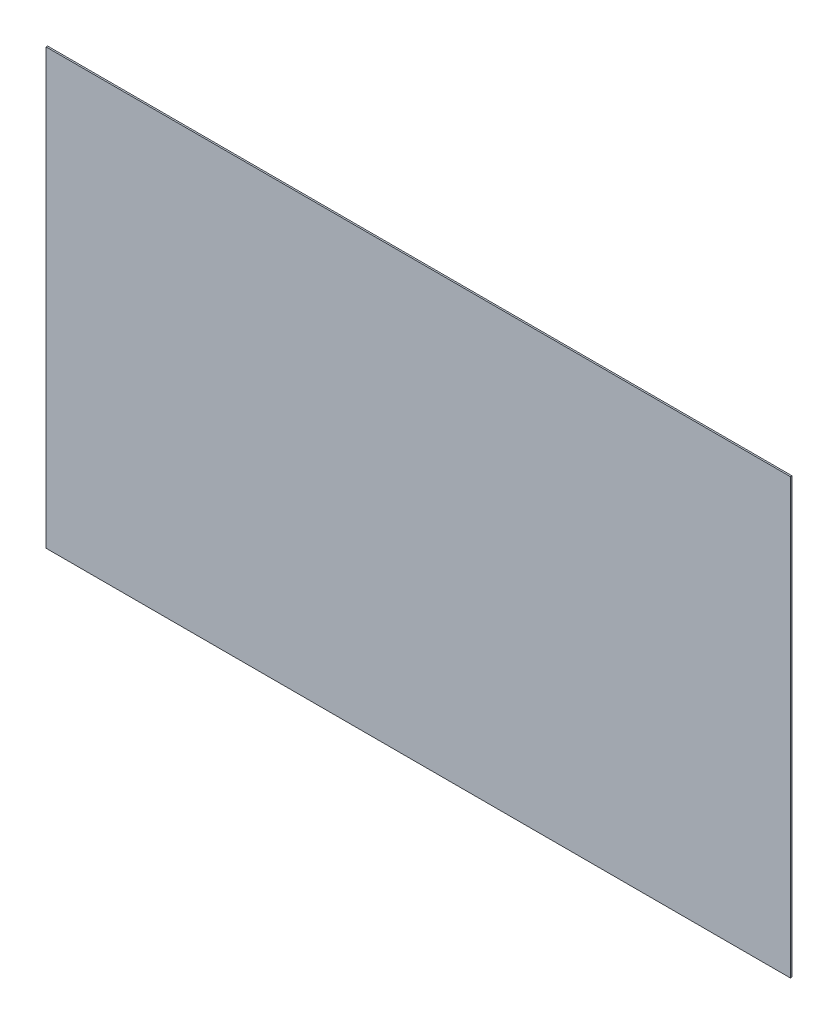
ISO-10303-21;
HEADER;
FILE_DESCRIPTION(('STEP AP214'),'2;1');
FILE_NAME('part.step','',(''),(''),'','','');
FILE_SCHEMA(('AUTOMOTIVE_DESIGN { 1 0 10303 214 1 1 1 1 }'));
ENDSEC;
DATA;
#1=APPLICATION_CONTEXT('core data for automotive mechanical design processes');
#2=APPLICATION_PROTOCOL_DEFINITION('international standard','automotive_design',2000,#1);
#3=PRODUCT_CONTEXT('',#1,'mechanical');
#4=PRODUCT('Part','Part','',(#3));
#5=PRODUCT_RELATED_PRODUCT_CATEGORY('part','',(#4));
#6=PRODUCT_DEFINITION_FORMATION('','',#4);
#7=PRODUCT_DEFINITION_CONTEXT('part definition',#1,'design');
#8=PRODUCT_DEFINITION('design','',#6,#7);
#9=PRODUCT_DEFINITION_SHAPE('','',#8);
#10=(LENGTH_UNIT() NAMED_UNIT(*) SI_UNIT(.MILLI.,.METRE.));
#11=(NAMED_UNIT(*) PLANE_ANGLE_UNIT() SI_UNIT($,.RADIAN.));
#12=(NAMED_UNIT(*) SI_UNIT($,.STERADIAN.) SOLID_ANGLE_UNIT());
#13=UNCERTAINTY_MEASURE_WITH_UNIT(LENGTH_MEASURE(1.E-05),#10,'distance_accuracy_value','');
#14=(GEOMETRIC_REPRESENTATION_CONTEXT(3) GLOBAL_UNCERTAINTY_ASSIGNED_CONTEXT((#13)) GLOBAL_UNIT_ASSIGNED_CONTEXT((#10,
#11,#12)) REPRESENTATION_CONTEXT('',''));
#15=CARTESIAN_POINT('',(0.,0.,0.));
#16=DIRECTION('',(0.,0.,1.));
#17=DIRECTION('',(1.,0.,0.));
#18=AXIS2_PLACEMENT_3D('',#15,#16,#17);
#19=CARTESIAN_POINT('',(-720.,1070.,-490.999999999995));
#20=DIRECTION('',(1.,0.,0.));
#21=DIRECTION('',(0.,1.,0.));
#22=AXIS2_PLACEMENT_3D('',#19,#20,#21);
#23=PLANE('',#22);
#24=DIRECTION('',(0.,-1.,0.));
#25=VECTOR('',#24,1.);
#26=CARTESIAN_POINT('',(-720.,1070.,-493.999999999995));
#27=LINE('',#26,#25);
#28=CARTESIAN_POINT('',(-720.,1070.,-493.999999999995));
#29=VERTEX_POINT('',#28);
#30=CARTESIAN_POINT('',(-720.,230.,-493.999999999995));
#31=VERTEX_POINT('',#30);
#32=EDGE_CURVE('E99',#29,#31,#27,.T.);
#33=ORIENTED_EDGE('',*,*,#32,.T.);
#34=DIRECTION('',(0.,0.,-1.));
#35=VECTOR('',#34,1.);
#36=CARTESIAN_POINT('',(-720.,230.,-490.999999999995));
#37=LINE('',#36,#35);
#38=CARTESIAN_POINT('',(-720.,230.,-490.999999999995));
#39=VERTEX_POINT('',#38);
#40=EDGE_CURVE('E11',#39,#31,#37,.T.);
#41=ORIENTED_EDGE('',*,*,#40,.F.);
#42=DIRECTION('',(0.,-1.,0.));
#43=VECTOR('',#42,1.);
#44=CARTESIAN_POINT('',(-720.,1070.,-490.999999999995));
#45=LINE('',#44,#43);
#46=CARTESIAN_POINT('',(-720.,1070.,-490.999999999995));
#47=VERTEX_POINT('',#46);
#48=EDGE_CURVE('E87',#47,#39,#45,.T.);
#49=ORIENTED_EDGE('',*,*,#48,.F.);
#50=DIRECTION('',(0.,0.,-1.));
#51=VECTOR('',#50,1.);
#52=CARTESIAN_POINT('',(-720.,1070.,-490.999999999995));
#53=LINE('',#52,#51);
#54=EDGE_CURVE('E95',#47,#29,#53,.T.);
#55=ORIENTED_EDGE('',*,*,#54,.T.);
#56=EDGE_LOOP('',(#33,#41,#49,#55));
#57=FACE_BOUND('',#56,.T.);
#58=ADVANCED_FACE('F36',(#57),#23,.F.);
#59=CARTESIAN_POINT('',(-720.,230.,-490.999999999995));
#60=DIRECTION('',(0.,1.,0.));
#61=DIRECTION('',(0.,0.,1.));
#62=AXIS2_PLACEMENT_3D('',#59,#60,#61);
#63=PLANE('',#62);
#64=DIRECTION('',(1.,0.,0.));
#65=VECTOR('',#64,1.);
#66=CARTESIAN_POINT('',(-720.,230.,-493.999999999995));
#67=LINE('',#66,#65);
#68=CARTESIAN_POINT('',(720.,230.,-493.999999999995));
#69=VERTEX_POINT('',#68);
#70=EDGE_CURVE('E91',#31,#69,#67,.T.);
#71=ORIENTED_EDGE('',*,*,#70,.T.);
#72=DIRECTION('',(0.,0.,-1.));
#73=VECTOR('',#72,1.);
#74=CARTESIAN_POINT('',(720.,230.,-490.999999999995));
#75=LINE('',#74,#73);
#76=CARTESIAN_POINT('',(720.,230.,-490.999999999995));
#77=VERTEX_POINT('',#76);
#78=EDGE_CURVE('E44',#77,#69,#75,.T.);
#79=ORIENTED_EDGE('',*,*,#78,.F.);
#80=DIRECTION('',(1.,0.,0.));
#81=VECTOR('',#80,1.);
#82=CARTESIAN_POINT('',(-720.,230.,-490.999999999995));
#83=LINE('',#82,#81);
#84=EDGE_CURVE('E82',#39,#77,#83,.T.);
#85=ORIENTED_EDGE('',*,*,#84,.F.);
#86=ORIENTED_EDGE('',*,*,#40,.T.);
#87=EDGE_LOOP('',(#71,#79,#85,#86));
#88=FACE_BOUND('',#87,.T.);
#89=ADVANCED_FACE('F90',(#88),#63,.F.);
#90=CARTESIAN_POINT('',(720.,1070.,-490.999999999995));
#91=DIRECTION('',(-1.,0.,0.));
#92=DIRECTION('',(0.,-1.,0.));
#93=AXIS2_PLACEMENT_3D('',#90,#91,#92);
#94=PLANE('',#93);
#95=DIRECTION('',(0.,1.,0.));
#96=VECTOR('',#95,1.);
#97=CARTESIAN_POINT('',(720.,1070.,-493.999999999995));
#98=LINE('',#97,#96);
#99=CARTESIAN_POINT('',(720.,1070.,-493.999999999995));
#100=VERTEX_POINT('',#99);
#101=EDGE_CURVE('E69',#69,#100,#98,.T.);
#102=ORIENTED_EDGE('',*,*,#101,.T.);
#103=DIRECTION('',(0.,0.,-1.));
#104=VECTOR('',#103,1.);
#105=CARTESIAN_POINT('',(720.,1070.,-490.999999999995));
#106=LINE('',#105,#104);
#107=CARTESIAN_POINT('',(720.,1070.,-490.999999999995));
#108=VERTEX_POINT('',#107);
#109=EDGE_CURVE('E92',#108,#100,#106,.T.);
#110=ORIENTED_EDGE('',*,*,#109,.F.);
#111=DIRECTION('',(0.,1.,0.));
#112=VECTOR('',#111,1.);
#113=CARTESIAN_POINT('',(720.,1070.,-490.999999999995));
#114=LINE('',#113,#112);
#115=EDGE_CURVE('E85',#77,#108,#114,.T.);
#116=ORIENTED_EDGE('',*,*,#115,.F.);
#117=ORIENTED_EDGE('',*,*,#78,.T.);
#118=EDGE_LOOP('',(#102,#110,#116,#117));
#119=FACE_BOUND('',#118,.T.);
#120=ADVANCED_FACE('F93',(#119),#94,.F.);
#121=CARTESIAN_POINT('',(-720.,1070.,-490.999999999995));
#122=DIRECTION('',(0.,-1.,0.));
#123=DIRECTION('',(0.,0.,-1.));
#124=AXIS2_PLACEMENT_3D('',#121,#122,#123);
#125=PLANE('',#124);
#126=DIRECTION('',(-1.,0.,0.));
#127=VECTOR('',#126,1.);
#128=CARTESIAN_POINT('',(-720.,1070.,-493.999999999995));
#129=LINE('',#128,#127);
#130=EDGE_CURVE('E75',#100,#29,#129,.T.);
#131=ORIENTED_EDGE('',*,*,#130,.T.);
#132=ORIENTED_EDGE('',*,*,#54,.F.);
#133=DIRECTION('',(-1.,0.,0.));
#134=VECTOR('',#133,1.);
#135=CARTESIAN_POINT('',(-720.,1070.,-490.999999999995));
#136=LINE('',#135,#134);
#137=EDGE_CURVE('E52',#108,#47,#136,.T.);
#138=ORIENTED_EDGE('',*,*,#137,.F.);
#139=ORIENTED_EDGE('',*,*,#109,.T.);
#140=EDGE_LOOP('',(#131,#132,#138,#139));
#141=FACE_BOUND('',#140,.T.);
#142=ADVANCED_FACE('F106',(#141),#125,.F.);
#143=CARTESIAN_POINT('',(0.,0.,-490.999999999995));
#144=DIRECTION('',(0.,0.,1.));
#145=DIRECTION('',(1.,0.,0.));
#146=AXIS2_PLACEMENT_3D('',#143,#144,#145);
#147=PLANE('',#146);
#148=ORIENTED_EDGE('',*,*,#48,.T.);
#149=ORIENTED_EDGE('',*,*,#84,.T.);
#150=ORIENTED_EDGE('',*,*,#115,.T.);
#151=ORIENTED_EDGE('',*,*,#137,.T.);
#152=EDGE_LOOP('',(#148,#149,#150,#151));
#153=FACE_BOUND('',#152,.T.);
#154=ADVANCED_FACE('F83',(#153),#147,.T.);
#155=CARTESIAN_POINT('',(0.,0.,-493.999999999995));
#156=DIRECTION('',(0.,0.,1.));
#157=DIRECTION('',(1.,0.,0.));
#158=AXIS2_PLACEMENT_3D('',#155,#156,#157);
#159=PLANE('',#158);
#160=ORIENTED_EDGE('',*,*,#32,.F.);
#161=ORIENTED_EDGE('',*,*,#130,.F.);
#162=ORIENTED_EDGE('',*,*,#101,.F.);
#163=ORIENTED_EDGE('',*,*,#70,.F.);
#164=EDGE_LOOP('',(#160,#161,#162,#163));
#165=FACE_BOUND('',#164,.T.);
#166=ADVANCED_FACE('F109',(#165),#159,.F.);
#167=CLOSED_SHELL('',(#58,#89,#120,#142,#154,#166));
#168=MANIFOLD_SOLID_BREP('B2',#167);
#169=ADVANCED_BREP_SHAPE_REPRESENTATION('',(#18,#168),#14);
#170=SHAPE_DEFINITION_REPRESENTATION(#9,#169);
ENDSEC;
END-ISO-10303-21;
